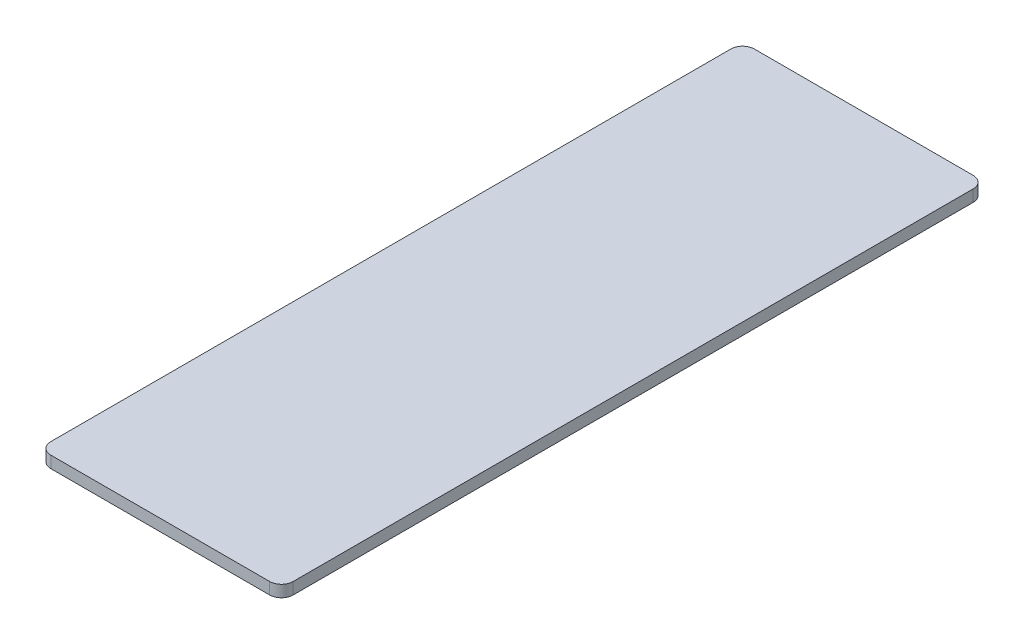
ISO-10303-21;
HEADER;
FILE_DESCRIPTION(('STEP AP214'),'2;1');
FILE_NAME('part.step','',(''),(''),'','','');
FILE_SCHEMA(('AUTOMOTIVE_DESIGN { 1 0 10303 214 1 1 1 1 }'));
ENDSEC;
DATA;
#1=APPLICATION_CONTEXT('core data for automotive mechanical design processes');
#2=APPLICATION_PROTOCOL_DEFINITION('international standard','automotive_design',2000,#1);
#3=PRODUCT_CONTEXT('',#1,'mechanical');
#4=PRODUCT('Part','Part','',(#3));
#5=PRODUCT_RELATED_PRODUCT_CATEGORY('part','',(#4));
#6=PRODUCT_DEFINITION_FORMATION('','',#4);
#7=PRODUCT_DEFINITION_CONTEXT('part definition',#1,'design');
#8=PRODUCT_DEFINITION('design','',#6,#7);
#9=PRODUCT_DEFINITION_SHAPE('','',#8);
#10=(LENGTH_UNIT() NAMED_UNIT(*) SI_UNIT(.MILLI.,.METRE.));
#11=(NAMED_UNIT(*) PLANE_ANGLE_UNIT() SI_UNIT($,.RADIAN.));
#12=(NAMED_UNIT(*) SI_UNIT($,.STERADIAN.) SOLID_ANGLE_UNIT());
#13=UNCERTAINTY_MEASURE_WITH_UNIT(LENGTH_MEASURE(1.E-05),#10,'distance_accuracy_value','');
#14=(GEOMETRIC_REPRESENTATION_CONTEXT(3) GLOBAL_UNCERTAINTY_ASSIGNED_CONTEXT((#13)) GLOBAL_UNIT_ASSIGNED_CONTEXT((#10,
#11,#12)) REPRESENTATION_CONTEXT('',''));
#15=CARTESIAN_POINT('',(0.,0.,0.));
#16=DIRECTION('',(0.,0.,1.));
#17=DIRECTION('',(1.,0.,0.));
#18=AXIS2_PLACEMENT_3D('',#15,#16,#17);
#19=CARTESIAN_POINT('',(28.,1.5,87.));
#20=DIRECTION('',(0.,-1.,0.));
#21=DIRECTION('',(0.,0.,-1.));
#22=AXIS2_PLACEMENT_3D('',#19,#20,#21);
#23=CYLINDRICAL_SURFACE('',#22,2.99999999999999);
#24=CARTESIAN_POINT('',(28.,-1.5,87.));
#25=DIRECTION('',(0.,1.,0.));
#26=DIRECTION('',(0.,0.,1.));
#27=AXIS2_PLACEMENT_3D('',#24,#25,#26);
#28=CIRCLE('',#27,2.99999999999999);
#29=CARTESIAN_POINT('',(28.,-1.5,90.));
#30=VERTEX_POINT('',#29);
#31=CARTESIAN_POINT('',(31.,-1.5,87.));
#32=VERTEX_POINT('',#31);
#33=EDGE_CURVE('E139',#30,#32,#28,.T.);
#34=ORIENTED_EDGE('',*,*,#33,.T.);
#35=DIRECTION('',(0.,-1.,0.));
#36=VECTOR('',#35,1.);
#37=CARTESIAN_POINT('',(31.,1.5,87.));
#38=LINE('',#37,#36);
#39=CARTESIAN_POINT('',(31.,1.5,87.));
#40=VERTEX_POINT('',#39);
#41=EDGE_CURVE('E11',#40,#32,#38,.T.);
#42=ORIENTED_EDGE('',*,*,#41,.F.);
#43=CARTESIAN_POINT('',(28.,1.5,87.));
#44=DIRECTION('',(0.,1.,0.));
#45=DIRECTION('',(0.,0.,1.));
#46=AXIS2_PLACEMENT_3D('',#43,#44,#45);
#47=CIRCLE('',#46,2.99999999999999);
#48=CARTESIAN_POINT('',(28.,1.5,90.));
#49=VERTEX_POINT('',#48);
#50=EDGE_CURVE('E153',#49,#40,#47,.T.);
#51=ORIENTED_EDGE('',*,*,#50,.F.);
#52=DIRECTION('',(0.,-1.,0.));
#53=VECTOR('',#52,1.);
#54=CARTESIAN_POINT('',(28.,1.5,90.));
#55=LINE('',#54,#53);
#56=EDGE_CURVE('E135',#49,#30,#55,.T.);
#57=ORIENTED_EDGE('',*,*,#56,.T.);
#58=EDGE_LOOP('',(#34,#42,#51,#57));
#59=FACE_BOUND('',#58,.T.);
#60=ADVANCED_FACE('F43',(#59),#23,.T.);
#61=CARTESIAN_POINT('',(31.,1.5,-87.));
#62=DIRECTION('',(-1.,0.,0.));
#63=DIRECTION('',(0.,0.,1.));
#64=AXIS2_PLACEMENT_3D('',#61,#62,#63);
#65=PLANE('',#64);
#66=DIRECTION('',(0.,0.,-1.));
#67=VECTOR('',#66,1.);
#68=CARTESIAN_POINT('',(31.,-1.5,-87.));
#69=LINE('',#68,#67);
#70=CARTESIAN_POINT('',(31.,-1.5,-87.));
#71=VERTEX_POINT('',#70);
#72=EDGE_CURVE('E142',#32,#71,#69,.T.);
#73=ORIENTED_EDGE('',*,*,#72,.T.);
#74=DIRECTION('',(0.,-1.,0.));
#75=VECTOR('',#74,1.);
#76=CARTESIAN_POINT('',(31.,1.5,-87.));
#77=LINE('',#76,#75);
#78=CARTESIAN_POINT('',(31.,1.5,-87.));
#79=VERTEX_POINT('',#78);
#80=EDGE_CURVE('E51',#79,#71,#77,.T.);
#81=ORIENTED_EDGE('',*,*,#80,.F.);
#82=DIRECTION('',(0.,0.,-1.));
#83=VECTOR('',#82,1.);
#84=CARTESIAN_POINT('',(31.,1.5,-87.));
#85=LINE('',#84,#83);
#86=EDGE_CURVE('E102',#40,#79,#85,.T.);
#87=ORIENTED_EDGE('',*,*,#86,.F.);
#88=ORIENTED_EDGE('',*,*,#41,.T.);
#89=EDGE_LOOP('',(#73,#81,#87,#88));
#90=FACE_BOUND('',#89,.T.);
#91=ADVANCED_FACE('F188',(#90),#65,.F.);
#92=CARTESIAN_POINT('',(28.,1.5,-87.));
#93=DIRECTION('',(0.,-1.,0.));
#94=DIRECTION('',(0.,0.,-1.));
#95=AXIS2_PLACEMENT_3D('',#92,#93,#94);
#96=CYLINDRICAL_SURFACE('',#95,3.);
#97=CARTESIAN_POINT('',(28.,-1.5,-87.));
#98=DIRECTION('',(0.,1.,0.));
#99=DIRECTION('',(0.,0.,-1.));
#100=AXIS2_PLACEMENT_3D('',#97,#98,#99);
#101=CIRCLE('',#100,3.);
#102=CARTESIAN_POINT('',(28.,-1.5,-90.));
#103=VERTEX_POINT('',#102);
#104=EDGE_CURVE('E144',#71,#103,#101,.T.);
#105=ORIENTED_EDGE('',*,*,#104,.T.);
#106=DIRECTION('',(0.,-1.,0.));
#107=VECTOR('',#106,1.);
#108=CARTESIAN_POINT('',(28.,1.5,-90.));
#109=LINE('',#108,#107);
#110=CARTESIAN_POINT('',(28.,1.5,-90.));
#111=VERTEX_POINT('',#110);
#112=EDGE_CURVE('E160',#111,#103,#109,.T.);
#113=ORIENTED_EDGE('',*,*,#112,.F.);
#114=CARTESIAN_POINT('',(28.,1.5,-87.));
#115=DIRECTION('',(0.,1.,0.));
#116=DIRECTION('',(0.,0.,-1.));
#117=AXIS2_PLACEMENT_3D('',#114,#115,#116);
#118=CIRCLE('',#117,3.);
#119=EDGE_CURVE('E168',#79,#111,#118,.T.);
#120=ORIENTED_EDGE('',*,*,#119,.F.);
#121=ORIENTED_EDGE('',*,*,#80,.T.);
#122=EDGE_LOOP('',(#105,#113,#120,#121));
#123=FACE_BOUND('',#122,.T.);
#124=ADVANCED_FACE('F166',(#123),#96,.T.);
#125=CARTESIAN_POINT('',(-28.,1.5,-90.));
#126=DIRECTION('',(0.,0.,1.));
#127=DIRECTION('',(1.,0.,0.));
#128=AXIS2_PLACEMENT_3D('',#125,#126,#127);
#129=PLANE('',#128);
#130=DIRECTION('',(-1.,0.,0.));
#131=VECTOR('',#130,1.);
#132=CARTESIAN_POINT('',(-28.,-1.5,-90.));
#133=LINE('',#132,#131);
#134=CARTESIAN_POINT('',(-28.,-1.5,-90.));
#135=VERTEX_POINT('',#134);
#136=EDGE_CURVE('E146',#103,#135,#133,.T.);
#137=ORIENTED_EDGE('',*,*,#136,.T.);
#138=DIRECTION('',(0.,-1.,0.));
#139=VECTOR('',#138,1.);
#140=CARTESIAN_POINT('',(-28.,1.5,-90.));
#141=LINE('',#140,#139);
#142=CARTESIAN_POINT('',(-28.,1.5,-90.));
#143=VERTEX_POINT('',#142);
#144=EDGE_CURVE('E157',#143,#135,#141,.T.);
#145=ORIENTED_EDGE('',*,*,#144,.F.);
#146=DIRECTION('',(-1.,0.,0.));
#147=VECTOR('',#146,1.);
#148=CARTESIAN_POINT('',(-28.,1.5,-90.));
#149=LINE('',#148,#147);
#150=EDGE_CURVE('E180',#111,#143,#149,.T.);
#151=ORIENTED_EDGE('',*,*,#150,.F.);
#152=ORIENTED_EDGE('',*,*,#112,.T.);
#153=EDGE_LOOP('',(#137,#145,#151,#152));
#154=FACE_BOUND('',#153,.T.);
#155=ADVANCED_FACE('F176',(#154),#129,.F.);
#156=CARTESIAN_POINT('',(-28.,1.5,-87.));
#157=DIRECTION('',(0.,-1.,0.));
#158=DIRECTION('',(0.,0.,-1.));
#159=AXIS2_PLACEMENT_3D('',#156,#157,#158);
#160=CYLINDRICAL_SURFACE('',#159,3.);
#161=CARTESIAN_POINT('',(-28.,-1.5,-87.));
#162=DIRECTION('',(0.,1.,0.));
#163=DIRECTION('',(0.,0.,1.));
#164=AXIS2_PLACEMENT_3D('',#161,#162,#163);
#165=CIRCLE('',#164,3.);
#166=CARTESIAN_POINT('',(-31.,-1.5,-87.));
#167=VERTEX_POINT('',#166);
#168=EDGE_CURVE('E148',#135,#167,#165,.T.);
#169=ORIENTED_EDGE('',*,*,#168,.T.);
#170=DIRECTION('',(0.,-1.,0.));
#171=VECTOR('',#170,1.);
#172=CARTESIAN_POINT('',(-31.,1.5,-87.));
#173=LINE('',#172,#171);
#174=CARTESIAN_POINT('',(-31.,1.5,-87.));
#175=VERTEX_POINT('',#174);
#176=EDGE_CURVE('E130',#175,#167,#173,.T.);
#177=ORIENTED_EDGE('',*,*,#176,.F.);
#178=CARTESIAN_POINT('',(-28.,1.5,-87.));
#179=DIRECTION('',(0.,1.,0.));
#180=DIRECTION('',(0.,0.,1.));
#181=AXIS2_PLACEMENT_3D('',#178,#179,#180);
#182=CIRCLE('',#181,3.);
#183=EDGE_CURVE('E121',#143,#175,#182,.T.);
#184=ORIENTED_EDGE('',*,*,#183,.F.);
#185=ORIENTED_EDGE('',*,*,#144,.T.);
#186=EDGE_LOOP('',(#169,#177,#184,#185));
#187=FACE_BOUND('',#186,.T.);
#188=ADVANCED_FACE('F179',(#187),#160,.T.);
#189=CARTESIAN_POINT('',(-31.,1.5,-87.));
#190=DIRECTION('',(1.,0.,0.));
#191=DIRECTION('',(0.,0.,-1.));
#192=AXIS2_PLACEMENT_3D('',#189,#190,#191);
#193=PLANE('',#192);
#194=DIRECTION('',(0.,0.,1.));
#195=VECTOR('',#194,1.);
#196=CARTESIAN_POINT('',(-31.,-1.5,-87.));
#197=LINE('',#196,#195);
#198=CARTESIAN_POINT('',(-31.,-1.5,87.));
#199=VERTEX_POINT('',#198);
#200=EDGE_CURVE('E129',#167,#199,#197,.T.);
#201=ORIENTED_EDGE('',*,*,#200,.T.);
#202=DIRECTION('',(0.,-1.,0.));
#203=VECTOR('',#202,1.);
#204=CARTESIAN_POINT('',(-31.,1.5,87.));
#205=LINE('',#204,#203);
#206=CARTESIAN_POINT('',(-31.,1.5,87.));
#207=VERTEX_POINT('',#206);
#208=EDGE_CURVE('E126',#207,#199,#205,.T.);
#209=ORIENTED_EDGE('',*,*,#208,.F.);
#210=DIRECTION('',(0.,0.,1.));
#211=VECTOR('',#210,1.);
#212=CARTESIAN_POINT('',(-31.,1.5,-87.));
#213=LINE('',#212,#211);
#214=EDGE_CURVE('E115',#175,#207,#213,.T.);
#215=ORIENTED_EDGE('',*,*,#214,.F.);
#216=ORIENTED_EDGE('',*,*,#176,.T.);
#217=EDGE_LOOP('',(#201,#209,#215,#216));
#218=FACE_BOUND('',#217,.T.);
#219=ADVANCED_FACE('F127',(#218),#193,.F.);
#220=CARTESIAN_POINT('',(-28.,1.5,87.));
#221=DIRECTION('',(0.,-1.,0.));
#222=DIRECTION('',(0.,0.,-1.));
#223=AXIS2_PLACEMENT_3D('',#220,#221,#222);
#224=CYLINDRICAL_SURFACE('',#223,3.);
#225=CARTESIAN_POINT('',(-28.,-1.5,87.));
#226=DIRECTION('',(0.,1.,0.));
#227=DIRECTION('',(0.,0.,1.));
#228=AXIS2_PLACEMENT_3D('',#225,#226,#227);
#229=CIRCLE('',#228,3.);
#230=CARTESIAN_POINT('',(-28.,-1.5,90.));
#231=VERTEX_POINT('',#230);
#232=EDGE_CURVE('E88',#199,#231,#229,.T.);
#233=ORIENTED_EDGE('',*,*,#232,.T.);
#234=DIRECTION('',(0.,-1.,0.));
#235=VECTOR('',#234,1.);
#236=CARTESIAN_POINT('',(-28.,1.5,90.));
#237=LINE('',#236,#235);
#238=CARTESIAN_POINT('',(-28.,1.5,90.));
#239=VERTEX_POINT('',#238);
#240=EDGE_CURVE('E131',#239,#231,#237,.T.);
#241=ORIENTED_EDGE('',*,*,#240,.F.);
#242=CARTESIAN_POINT('',(-28.,1.5,87.));
#243=DIRECTION('',(0.,1.,0.));
#244=DIRECTION('',(0.,0.,1.));
#245=AXIS2_PLACEMENT_3D('',#242,#243,#244);
#246=CIRCLE('',#245,3.);
#247=EDGE_CURVE('E119',#207,#239,#246,.T.);
#248=ORIENTED_EDGE('',*,*,#247,.F.);
#249=ORIENTED_EDGE('',*,*,#208,.T.);
#250=EDGE_LOOP('',(#233,#241,#248,#249));
#251=FACE_BOUND('',#250,.T.);
#252=ADVANCED_FACE('F133',(#251),#224,.T.);
#253=CARTESIAN_POINT('',(-28.,1.5,90.));
#254=DIRECTION('',(0.,0.,-1.));
#255=DIRECTION('',(-1.,0.,0.));
#256=AXIS2_PLACEMENT_3D('',#253,#254,#255);
#257=PLANE('',#256);
#258=DIRECTION('',(1.,0.,0.));
#259=VECTOR('',#258,1.);
#260=CARTESIAN_POINT('',(-28.,-1.5,90.));
#261=LINE('',#260,#259);
#262=EDGE_CURVE('E94',#231,#30,#261,.T.);
#263=ORIENTED_EDGE('',*,*,#262,.T.);
#264=ORIENTED_EDGE('',*,*,#56,.F.);
#265=DIRECTION('',(1.,0.,0.));
#266=VECTOR('',#265,1.);
#267=CARTESIAN_POINT('',(-28.,1.5,90.));
#268=LINE('',#267,#266);
#269=EDGE_CURVE('E59',#239,#49,#268,.T.);
#270=ORIENTED_EDGE('',*,*,#269,.F.);
#271=ORIENTED_EDGE('',*,*,#240,.T.);
#272=EDGE_LOOP('',(#263,#264,#270,#271));
#273=FACE_BOUND('',#272,.T.);
#274=ADVANCED_FACE('F204',(#273),#257,.F.);
#275=CARTESIAN_POINT('',(28.,1.5,87.));
#276=DIRECTION('',(0.,1.,0.));
#277=DIRECTION('',(0.,0.,1.));
#278=AXIS2_PLACEMENT_3D('',#275,#276,#277);
#279=PLANE('',#278);
#280=ORIENTED_EDGE('',*,*,#50,.T.);
#281=ORIENTED_EDGE('',*,*,#86,.T.);
#282=ORIENTED_EDGE('',*,*,#119,.T.);
#283=ORIENTED_EDGE('',*,*,#150,.T.);
#284=ORIENTED_EDGE('',*,*,#183,.T.);
#285=ORIENTED_EDGE('',*,*,#214,.T.);
#286=ORIENTED_EDGE('',*,*,#247,.T.);
#287=ORIENTED_EDGE('',*,*,#269,.T.);
#288=EDGE_LOOP('',(#280,#281,#282,#283,#284,#285,#286,#287));
#289=FACE_BOUND('',#288,.T.);
#290=ADVANCED_FACE('F117',(#289),#279,.T.);
#291=CARTESIAN_POINT('',(28.,-1.5,87.));
#292=DIRECTION('',(0.,1.,0.));
#293=DIRECTION('',(0.,0.,1.));
#294=AXIS2_PLACEMENT_3D('',#291,#292,#293);
#295=PLANE('',#294);
#296=ORIENTED_EDGE('',*,*,#33,.F.);
#297=ORIENTED_EDGE('',*,*,#262,.F.);
#298=ORIENTED_EDGE('',*,*,#232,.F.);
#299=ORIENTED_EDGE('',*,*,#200,.F.);
#300=ORIENTED_EDGE('',*,*,#168,.F.);
#301=ORIENTED_EDGE('',*,*,#136,.F.);
#302=ORIENTED_EDGE('',*,*,#104,.F.);
#303=ORIENTED_EDGE('',*,*,#72,.F.);
#304=EDGE_LOOP('',(#296,#297,#298,#299,#300,#301,#302,#303));
#305=FACE_BOUND('',#304,.T.);
#306=ADVANCED_FACE('F172',(#305),#295,.F.);
#307=CLOSED_SHELL('',(#60,#91,#124,#155,#188,#219,#252,#274,#290,#306));
#308=MANIFOLD_SOLID_BREP('B2',#307);
#309=ADVANCED_BREP_SHAPE_REPRESENTATION('',(#18,#308),#14);
#310=SHAPE_DEFINITION_REPRESENTATION(#9,#309);
ENDSEC;
END-ISO-10303-21;
